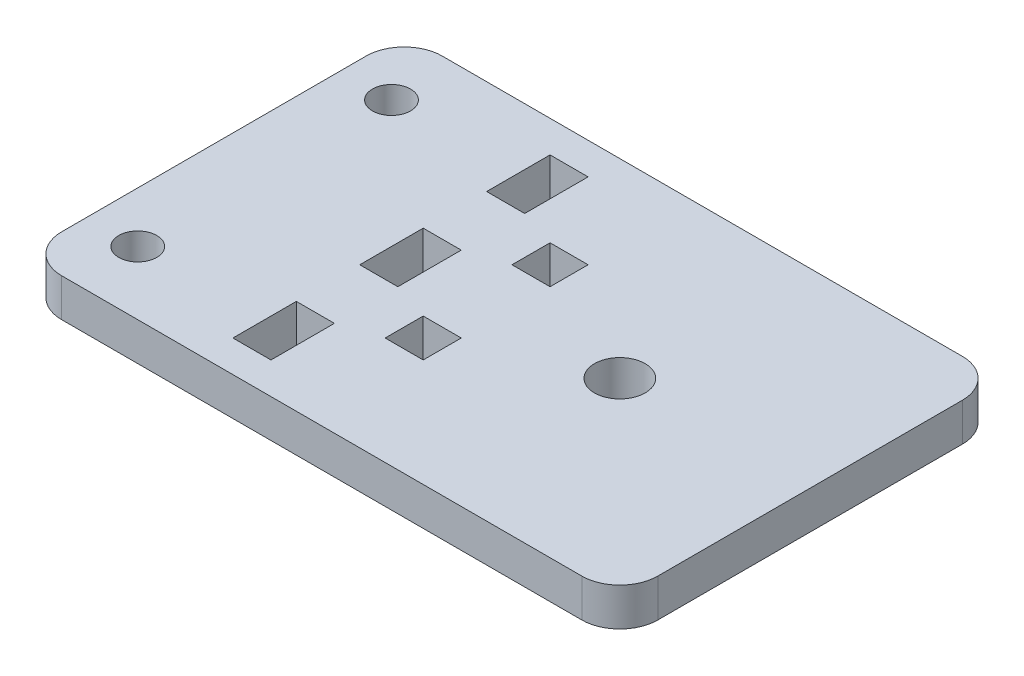
ISO-10303-21;
HEADER;
FILE_DESCRIPTION(('STEP AP214'),'2;1');
FILE_NAME('part.step','',(''),(''),'','','');
FILE_SCHEMA(('AUTOMOTIVE_DESIGN { 1 0 10303 214 1 1 1 1 }'));
ENDSEC;
DATA;
#1=APPLICATION_CONTEXT('core data for automotive mechanical design processes');
#2=APPLICATION_PROTOCOL_DEFINITION('international standard','automotive_design',2000,#1);
#3=PRODUCT_CONTEXT('',#1,'mechanical');
#4=PRODUCT('Part','Part','',(#3));
#5=PRODUCT_RELATED_PRODUCT_CATEGORY('part','',(#4));
#6=PRODUCT_DEFINITION_FORMATION('','',#4);
#7=PRODUCT_DEFINITION_CONTEXT('part definition',#1,'design');
#8=PRODUCT_DEFINITION('design','',#6,#7);
#9=PRODUCT_DEFINITION_SHAPE('','',#8);
#10=(LENGTH_UNIT() NAMED_UNIT(*) SI_UNIT(.MILLI.,.METRE.));
#11=(NAMED_UNIT(*) PLANE_ANGLE_UNIT() SI_UNIT($,.RADIAN.));
#12=(NAMED_UNIT(*) SI_UNIT($,.STERADIAN.) SOLID_ANGLE_UNIT());
#13=UNCERTAINTY_MEASURE_WITH_UNIT(LENGTH_MEASURE(1.E-05),#10,'distance_accuracy_value','');
#14=(GEOMETRIC_REPRESENTATION_CONTEXT(3) GLOBAL_UNCERTAINTY_ASSIGNED_CONTEXT((#13)) GLOBAL_UNIT_ASSIGNED_CONTEXT((#10,
#11,#12)) REPRESENTATION_CONTEXT('',''));
#15=CARTESIAN_POINT('',(0.,0.,0.));
#16=DIRECTION('',(0.,0.,1.));
#17=DIRECTION('',(1.,0.,0.));
#18=AXIS2_PLACEMENT_3D('',#15,#16,#17);
#19=CARTESIAN_POINT('',(-8.5,3.,-15.));
#20=DIRECTION('',(0.,0.,1.));
#21=DIRECTION('',(1.,0.,0.));
#22=AXIS2_PLACEMENT_3D('',#19,#20,#21);
#23=PLANE('',#22);
#24=DIRECTION('',(-1.,0.,0.));
#25=VECTOR('',#24,1.);
#26=CARTESIAN_POINT('',(-8.5,3.,-15.));
#27=LINE('',#26,#25);
#28=CARTESIAN_POINT('',(35.5,3.,-15.));
#29=VERTEX_POINT('',#28);
#30=CARTESIAN_POINT('',(-5.5,3.,-15.));
#31=VERTEX_POINT('',#30);
#32=EDGE_CURVE('E381',#29,#31,#27,.T.);
#33=ORIENTED_EDGE('',*,*,#32,.F.);
#34=DIRECTION('',(0.,1.,0.));
#35=VECTOR('',#34,1.);
#36=CARTESIAN_POINT('',(35.5,0.,-15.));
#37=LINE('',#36,#35);
#38=CARTESIAN_POINT('',(35.5,0.,-15.));
#39=VERTEX_POINT('',#38);
#40=EDGE_CURVE('E425',#29,#39,#37,.F.);
#41=ORIENTED_EDGE('',*,*,#40,.T.);
#42=DIRECTION('',(-1.,0.,0.));
#43=VECTOR('',#42,1.);
#44=CARTESIAN_POINT('',(-8.5,0.,-15.));
#45=LINE('',#44,#43);
#46=CARTESIAN_POINT('',(-5.5,0.,-15.));
#47=VERTEX_POINT('',#46);
#48=EDGE_CURVE('E374',#39,#47,#45,.T.);
#49=ORIENTED_EDGE('',*,*,#48,.T.);
#50=DIRECTION('',(0.,-1.,0.));
#51=VECTOR('',#50,1.);
#52=CARTESIAN_POINT('',(-5.5,3.,-15.));
#53=LINE('',#52,#51);
#54=EDGE_CURVE('E406',#47,#31,#53,.F.);
#55=ORIENTED_EDGE('',*,*,#54,.T.);
#56=EDGE_LOOP('',(#33,#41,#49,#55));
#57=FACE_BOUND('',#56,.T.);
#58=ADVANCED_FACE('F33',(#57),#23,.F.);
#59=CARTESIAN_POINT('',(-8.5,3.,-15.));
#60=DIRECTION('',(1.,0.,0.));
#61=DIRECTION('',(0.,0.,-1.));
#62=AXIS2_PLACEMENT_3D('',#59,#60,#61);
#63=PLANE('',#62);
#64=DIRECTION('',(0.,0.,1.));
#65=VECTOR('',#64,1.);
#66=CARTESIAN_POINT('',(-8.5,3.,-15.));
#67=LINE('',#66,#65);
#68=CARTESIAN_POINT('',(-8.5,3.,-12.));
#69=VERTEX_POINT('',#68);
#70=CARTESIAN_POINT('',(-8.5,3.,12.));
#71=VERTEX_POINT('',#70);
#72=EDGE_CURVE('E383',#69,#71,#67,.T.);
#73=ORIENTED_EDGE('',*,*,#72,.F.);
#74=DIRECTION('',(0.,-1.,0.));
#75=VECTOR('',#74,1.);
#76=CARTESIAN_POINT('',(-8.5,3.,-12.));
#77=LINE('',#76,#75);
#78=CARTESIAN_POINT('',(-8.5,0.,-12.));
#79=VERTEX_POINT('',#78);
#80=EDGE_CURVE('E398',#69,#79,#77,.T.);
#81=ORIENTED_EDGE('',*,*,#80,.T.);
#82=DIRECTION('',(0.,0.,1.));
#83=VECTOR('',#82,1.);
#84=CARTESIAN_POINT('',(-8.5,0.,-15.));
#85=LINE('',#84,#83);
#86=CARTESIAN_POINT('',(-8.5,0.,12.));
#87=VERTEX_POINT('',#86);
#88=EDGE_CURVE('E392',#79,#87,#85,.T.);
#89=ORIENTED_EDGE('',*,*,#88,.T.);
#90=DIRECTION('',(0.,-1.,0.));
#91=VECTOR('',#90,1.);
#92=CARTESIAN_POINT('',(-8.5,3.,12.));
#93=LINE('',#92,#91);
#94=EDGE_CURVE('E390',#87,#71,#93,.F.);
#95=ORIENTED_EDGE('',*,*,#94,.T.);
#96=EDGE_LOOP('',(#73,#81,#89,#95));
#97=FACE_BOUND('',#96,.T.);
#98=ADVANCED_FACE('F470',(#97),#63,.F.);
#99=CARTESIAN_POINT('',(-8.5,3.,15.));
#100=DIRECTION('',(0.,0.,-1.));
#101=DIRECTION('',(-1.,0.,0.));
#102=AXIS2_PLACEMENT_3D('',#99,#100,#101);
#103=PLANE('',#102);
#104=DIRECTION('',(1.,0.,0.));
#105=VECTOR('',#104,1.);
#106=CARTESIAN_POINT('',(-8.5,0.,15.));
#107=LINE('',#106,#105);
#108=CARTESIAN_POINT('',(-5.5,0.,15.));
#109=VERTEX_POINT('',#108);
#110=CARTESIAN_POINT('',(35.5,0.,15.));
#111=VERTEX_POINT('',#110);
#112=EDGE_CURVE('E384',#109,#111,#107,.T.);
#113=ORIENTED_EDGE('',*,*,#112,.T.);
#114=DIRECTION('',(0.,1.,0.));
#115=VECTOR('',#114,1.);
#116=CARTESIAN_POINT('',(35.5,3.,15.));
#117=LINE('',#116,#115);
#118=CARTESIAN_POINT('',(35.5,3.,15.));
#119=VERTEX_POINT('',#118);
#120=EDGE_CURVE('E431',#111,#119,#117,.T.);
#121=ORIENTED_EDGE('',*,*,#120,.T.);
#122=DIRECTION('',(1.,0.,0.));
#123=VECTOR('',#122,1.);
#124=CARTESIAN_POINT('',(-8.5,3.,15.));
#125=LINE('',#124,#123);
#126=CARTESIAN_POINT('',(-5.5,3.,15.));
#127=VERTEX_POINT('',#126);
#128=EDGE_CURVE('E387',#127,#119,#125,.T.);
#129=ORIENTED_EDGE('',*,*,#128,.F.);
#130=DIRECTION('',(0.,-1.,0.));
#131=VECTOR('',#130,1.);
#132=CARTESIAN_POINT('',(-5.5,3.,15.));
#133=LINE('',#132,#131);
#134=EDGE_CURVE('E413',#127,#109,#133,.T.);
#135=ORIENTED_EDGE('',*,*,#134,.T.);
#136=EDGE_LOOP('',(#113,#121,#129,#135));
#137=FACE_BOUND('',#136,.T.);
#138=ADVANCED_FACE('F476',(#137),#103,.F.);
#139=CARTESIAN_POINT('',(0.,3.,0.));
#140=DIRECTION('',(0.,1.,0.));
#141=DIRECTION('',(0.,0.,1.));
#142=AXIS2_PLACEMENT_3D('',#139,#140,#141);
#143=PLANE('',#142);
#144=DIRECTION('',(1.,0.,0.));
#145=VECTOR('',#144,1.);
#146=CARTESIAN_POINT('',(11.5,3.,6.5));
#147=LINE('',#146,#145);
#148=CARTESIAN_POINT('',(11.5,3.,6.5));
#149=VERTEX_POINT('',#148);
#150=CARTESIAN_POINT('',(14.5,3.,6.5));
#151=VERTEX_POINT('',#150);
#152=EDGE_CURVE('E48',#149,#151,#147,.T.);
#153=ORIENTED_EDGE('',*,*,#152,.F.);
#154=DIRECTION('',(0.,0.,1.));
#155=VECTOR('',#154,1.);
#156=CARTESIAN_POINT('',(11.5,3.,6.5));
#157=LINE('',#156,#155);
#158=CARTESIAN_POINT('',(11.5,3.,3.5));
#159=VERTEX_POINT('',#158);
#160=EDGE_CURVE('E237',#159,#149,#157,.T.);
#161=ORIENTED_EDGE('',*,*,#160,.F.);
#162=DIRECTION('',(-1.,0.,0.));
#163=VECTOR('',#162,1.);
#164=CARTESIAN_POINT('',(11.5,3.,3.5));
#165=LINE('',#164,#163);
#166=CARTESIAN_POINT('',(14.5,3.,3.5));
#167=VERTEX_POINT('',#166);
#168=EDGE_CURVE('E221',#167,#159,#165,.T.);
#169=ORIENTED_EDGE('',*,*,#168,.F.);
#170=DIRECTION('',(0.,0.,-1.));
#171=VECTOR('',#170,1.);
#172=CARTESIAN_POINT('',(14.5,3.,6.5));
#173=LINE('',#172,#171);
#174=EDGE_CURVE('E230',#151,#167,#173,.T.);
#175=ORIENTED_EDGE('',*,*,#174,.F.);
#176=EDGE_LOOP('',(#153,#161,#169,#175));
#177=FACE_BOUND('',#176,.T.);
#178=DIRECTION('',(1.,0.,0.));
#179=VECTOR('',#178,1.);
#180=CARTESIAN_POINT('',(11.5,3.,-3.49999999999999));
#181=LINE('',#180,#179);
#182=CARTESIAN_POINT('',(11.5,3.,-3.49999999999999));
#183=VERTEX_POINT('',#182);
#184=CARTESIAN_POINT('',(14.5,3.,-3.5));
#185=VERTEX_POINT('',#184);
#186=EDGE_CURVE('E244',#183,#185,#181,.T.);
#187=ORIENTED_EDGE('',*,*,#186,.F.);
#188=DIRECTION('',(0.,0.,1.));
#189=VECTOR('',#188,1.);
#190=CARTESIAN_POINT('',(11.5,3.,-3.49999999999999));
#191=LINE('',#190,#189);
#192=CARTESIAN_POINT('',(11.5,3.,-6.5));
#193=VERTEX_POINT('',#192);
#194=EDGE_CURVE('E254',#193,#183,#191,.T.);
#195=ORIENTED_EDGE('',*,*,#194,.F.);
#196=DIRECTION('',(-1.,0.,0.));
#197=VECTOR('',#196,1.);
#198=CARTESIAN_POINT('',(11.5,3.,-6.5));
#199=LINE('',#198,#197);
#200=CARTESIAN_POINT('',(14.5,3.,-6.5));
#201=VERTEX_POINT('',#200);
#202=EDGE_CURVE('E251',#201,#193,#199,.T.);
#203=ORIENTED_EDGE('',*,*,#202,.F.);
#204=DIRECTION('',(0.,0.,-1.));
#205=VECTOR('',#204,1.);
#206=CARTESIAN_POINT('',(14.5,3.,-3.5));
#207=LINE('',#206,#205);
#208=EDGE_CURVE('E248',#185,#201,#207,.T.);
#209=ORIENTED_EDGE('',*,*,#208,.F.);
#210=EDGE_LOOP('',(#187,#195,#203,#209));
#211=FACE_BOUND('',#210,.T.);
#212=CARTESIAN_POINT('',(23.5,3.,0.));
#213=DIRECTION('',(0.,1.,0.));
#214=DIRECTION('',(0.,0.,1.));
#215=AXIS2_PLACEMENT_3D('',#212,#213,#214);
#216=CIRCLE('',#215,2.);
#217=CARTESIAN_POINT('',(23.5,3.,2.00000000000001));
#218=VERTEX_POINT('',#217);
#219=EDGE_CURVE('E260',#218,#218,#216,.T.);
#220=ORIENTED_EDGE('',*,*,#219,.F.);
#221=EDGE_LOOP('',(#220));
#222=FACE_BOUND('',#221,.T.);
#223=DIRECTION('',(0.,0.,-1.));
#224=VECTOR('',#223,1.);
#225=CARTESIAN_POINT('',(38.5,3.,15.));
#226=LINE('',#225,#224);
#227=CARTESIAN_POINT('',(38.5,3.,12.));
#228=VERTEX_POINT('',#227);
#229=CARTESIAN_POINT('',(38.5,3.,-12.));
#230=VERTEX_POINT('',#229);
#231=EDGE_CURVE('E270',#228,#230,#226,.T.);
#232=ORIENTED_EDGE('',*,*,#231,.T.);
#233=CARTESIAN_POINT('',(35.5,3.,-12.));
#234=DIRECTION('',(0.,1.,0.));
#235=DIRECTION('',(0.,0.,1.));
#236=AXIS2_PLACEMENT_3D('',#233,#234,#235);
#237=CIRCLE('',#236,3.);
#238=EDGE_CURVE('E423',#230,#29,#237,.T.);
#239=ORIENTED_EDGE('',*,*,#238,.T.);
#240=ORIENTED_EDGE('',*,*,#32,.T.);
#241=CARTESIAN_POINT('',(-5.5,3.,-12.));
#242=DIRECTION('',(0.,1.,0.));
#243=DIRECTION('',(0.,0.,1.));
#244=AXIS2_PLACEMENT_3D('',#241,#242,#243);
#245=CIRCLE('',#244,3.);
#246=EDGE_CURVE('E411',#31,#69,#245,.T.);
#247=ORIENTED_EDGE('',*,*,#246,.T.);
#248=ORIENTED_EDGE('',*,*,#72,.T.);
#249=CARTESIAN_POINT('',(-5.5,3.,12.));
#250=DIRECTION('',(0.,1.,0.));
#251=DIRECTION('',(0.,0.,1.));
#252=AXIS2_PLACEMENT_3D('',#249,#250,#251);
#253=CIRCLE('',#252,3.);
#254=EDGE_CURVE('E409',#71,#127,#253,.T.);
#255=ORIENTED_EDGE('',*,*,#254,.T.);
#256=ORIENTED_EDGE('',*,*,#128,.T.);
#257=CARTESIAN_POINT('',(35.5,3.,12.));
#258=DIRECTION('',(0.,1.,0.));
#259=DIRECTION('',(0.,0.,1.));
#260=AXIS2_PLACEMENT_3D('',#257,#258,#259);
#261=CIRCLE('',#260,3.);
#262=EDGE_CURVE('E421',#119,#228,#261,.T.);
#263=ORIENTED_EDGE('',*,*,#262,.T.);
#264=EDGE_LOOP('',(#232,#239,#240,#247,#248,#255,#256,#263));
#265=FACE_BOUND('',#264,.T.);
#266=DIRECTION('',(0.,0.,1.));
#267=VECTOR('',#266,1.);
#268=CARTESIAN_POINT('',(8.5,3.,15.));
#269=LINE('',#268,#267);
#270=CARTESIAN_POINT('',(8.5,3.,-12.5));
#271=VERTEX_POINT('',#270);
#272=CARTESIAN_POINT('',(8.5,3.,-7.5));
#273=VERTEX_POINT('',#272);
#274=EDGE_CURVE('E277',#271,#273,#269,.T.);
#275=ORIENTED_EDGE('',*,*,#274,.T.);
#276=DIRECTION('',(1.,0.,0.));
#277=VECTOR('',#276,1.);
#278=CARTESIAN_POINT('',(5.5,3.,-7.5));
#279=LINE('',#278,#277);
#280=CARTESIAN_POINT('',(5.5,3.,-7.5));
#281=VERTEX_POINT('',#280);
#282=EDGE_CURVE('E358',#281,#273,#279,.T.);
#283=ORIENTED_EDGE('',*,*,#282,.F.);
#284=DIRECTION('',(0.,0.,1.));
#285=VECTOR('',#284,1.);
#286=CARTESIAN_POINT('',(5.5,3.,-12.5));
#287=LINE('',#286,#285);
#288=CARTESIAN_POINT('',(5.5,3.,-12.5));
#289=VERTEX_POINT('',#288);
#290=EDGE_CURVE('E367',#289,#281,#287,.T.);
#291=ORIENTED_EDGE('',*,*,#290,.F.);
#292=DIRECTION('',(-1.,0.,0.));
#293=VECTOR('',#292,1.);
#294=CARTESIAN_POINT('',(8.5,3.,-12.5));
#295=LINE('',#294,#293);
#296=EDGE_CURVE('E323',#271,#289,#295,.T.);
#297=ORIENTED_EDGE('',*,*,#296,.F.);
#298=EDGE_LOOP('',(#275,#283,#291,#297));
#299=FACE_BOUND('',#298,.T.);
#300=CARTESIAN_POINT('',(8.5,3.,-2.5));
#301=VERTEX_POINT('',#300);
#302=CARTESIAN_POINT('',(8.5,3.,2.5));
#303=VERTEX_POINT('',#302);
#304=EDGE_CURVE('E287',#301,#303,#269,.T.);
#305=ORIENTED_EDGE('',*,*,#304,.T.);
#306=DIRECTION('',(1.,0.,0.));
#307=VECTOR('',#306,1.);
#308=CARTESIAN_POINT('',(8.5,3.,2.5));
#309=LINE('',#308,#307);
#310=CARTESIAN_POINT('',(5.50000000000001,3.,2.5));
#311=VERTEX_POINT('',#310);
#312=EDGE_CURVE('E305',#311,#303,#309,.T.);
#313=ORIENTED_EDGE('',*,*,#312,.F.);
#314=DIRECTION('',(0.,0.,1.));
#315=VECTOR('',#314,1.);
#316=CARTESIAN_POINT('',(5.5,3.,-2.5));
#317=LINE('',#316,#315);
#318=CARTESIAN_POINT('',(5.5,3.,-2.5));
#319=VERTEX_POINT('',#318);
#320=EDGE_CURVE('E315',#319,#311,#317,.T.);
#321=ORIENTED_EDGE('',*,*,#320,.F.);
#322=DIRECTION('',(-1.,0.,0.));
#323=VECTOR('',#322,1.);
#324=CARTESIAN_POINT('',(8.5,3.,-2.5));
#325=LINE('',#324,#323);
#326=EDGE_CURVE('E312',#301,#319,#325,.T.);
#327=ORIENTED_EDGE('',*,*,#326,.F.);
#328=EDGE_LOOP('',(#305,#313,#321,#327));
#329=FACE_BOUND('',#328,.T.);
#330=CARTESIAN_POINT('',(-4.5,3.,10.));
#331=DIRECTION('',(0.,1.,0.));
#332=DIRECTION('',(0.,0.,1.));
#333=AXIS2_PLACEMENT_3D('',#330,#331,#332);
#334=CIRCLE('',#333,1.5);
#335=CARTESIAN_POINT('',(-4.5,3.,11.5));
#336=VERTEX_POINT('',#335);
#337=EDGE_CURVE('E292',#336,#336,#334,.T.);
#338=ORIENTED_EDGE('',*,*,#337,.F.);
#339=EDGE_LOOP('',(#338));
#340=FACE_BOUND('',#339,.T.);
#341=CARTESIAN_POINT('',(-4.5,3.,-10.));
#342=DIRECTION('',(0.,1.,0.));
#343=DIRECTION('',(0.,0.,1.));
#344=AXIS2_PLACEMENT_3D('',#341,#342,#343);
#345=CIRCLE('',#344,1.5);
#346=CARTESIAN_POINT('',(-4.5,3.,-8.5));
#347=VERTEX_POINT('',#346);
#348=EDGE_CURVE('E291',#347,#347,#345,.T.);
#349=ORIENTED_EDGE('',*,*,#348,.F.);
#350=EDGE_LOOP('',(#349));
#351=FACE_BOUND('',#350,.T.);
#352=DIRECTION('',(-1.,0.,0.));
#353=VECTOR('',#352,1.);
#354=CARTESIAN_POINT('',(8.5,3.,7.5));
#355=LINE('',#354,#353);
#356=CARTESIAN_POINT('',(8.5,3.,7.5));
#357=VERTEX_POINT('',#356);
#358=CARTESIAN_POINT('',(5.5,3.,7.5));
#359=VERTEX_POINT('',#358);
#360=EDGE_CURVE('E298',#357,#359,#355,.T.);
#361=ORIENTED_EDGE('',*,*,#360,.F.);
#362=CARTESIAN_POINT('',(8.5,3.,12.5));
#363=VERTEX_POINT('',#362);
#364=EDGE_CURVE('E284',#357,#363,#269,.T.);
#365=ORIENTED_EDGE('',*,*,#364,.T.);
#366=DIRECTION('',(1.,0.,0.));
#367=VECTOR('',#366,1.);
#368=CARTESIAN_POINT('',(8.5,3.,12.5));
#369=LINE('',#368,#367);
#370=CARTESIAN_POINT('',(5.50000000000001,3.,12.5));
#371=VERTEX_POINT('',#370);
#372=EDGE_CURVE('E334',#371,#363,#369,.T.);
#373=ORIENTED_EDGE('',*,*,#372,.F.);
#374=DIRECTION('',(0.,0.,1.));
#375=VECTOR('',#374,1.);
#376=CARTESIAN_POINT('',(5.5,3.,7.5));
#377=LINE('',#376,#375);
#378=EDGE_CURVE('E343',#359,#371,#377,.T.);
#379=ORIENTED_EDGE('',*,*,#378,.F.);
#380=EDGE_LOOP('',(#361,#365,#373,#379));
#381=FACE_BOUND('',#380,.T.);
#382=ADVANCED_FACE('F234',(#177,#211,#222,#265,#299,#329,#340,#351,#381),#143,.T.);
#383=CARTESIAN_POINT('',(0.,0.,0.));
#384=DIRECTION('',(0.,1.,0.));
#385=DIRECTION('',(0.,0.,1.));
#386=AXIS2_PLACEMENT_3D('',#383,#384,#385);
#387=PLANE('',#386);
#388=DIRECTION('',(0.,0.,1.));
#389=VECTOR('',#388,1.);
#390=CARTESIAN_POINT('',(11.5,0.,0.));
#391=LINE('',#390,#389);
#392=CARTESIAN_POINT('',(11.5,0.,3.5));
#393=VERTEX_POINT('',#392);
#394=CARTESIAN_POINT('',(11.5,0.,6.5));
#395=VERTEX_POINT('',#394);
#396=EDGE_CURVE('E41',#393,#395,#391,.T.);
#397=ORIENTED_EDGE('',*,*,#396,.T.);
#398=DIRECTION('',(1.,0.,0.));
#399=VECTOR('',#398,1.);
#400=CARTESIAN_POINT('',(0.,0.,6.50000000000001));
#401=LINE('',#400,#399);
#402=CARTESIAN_POINT('',(14.5,0.,6.5));
#403=VERTEX_POINT('',#402);
#404=EDGE_CURVE('E11',#395,#403,#401,.T.);
#405=ORIENTED_EDGE('',*,*,#404,.T.);
#406=DIRECTION('',(0.,0.,-1.));
#407=VECTOR('',#406,1.);
#408=CARTESIAN_POINT('',(14.5,0.,0.));
#409=LINE('',#408,#407);
#410=CARTESIAN_POINT('',(14.5,0.,3.5));
#411=VERTEX_POINT('',#410);
#412=EDGE_CURVE('E446',#403,#411,#409,.T.);
#413=ORIENTED_EDGE('',*,*,#412,.T.);
#414=DIRECTION('',(-1.,0.,0.));
#415=VECTOR('',#414,1.);
#416=CARTESIAN_POINT('',(0.,0.,3.5));
#417=LINE('',#416,#415);
#418=EDGE_CURVE('E224',#411,#393,#417,.T.);
#419=ORIENTED_EDGE('',*,*,#418,.T.);
#420=EDGE_LOOP('',(#397,#405,#413,#419));
#421=FACE_BOUND('',#420,.T.);
#422=DIRECTION('',(0.,0.,1.));
#423=VECTOR('',#422,1.);
#424=CARTESIAN_POINT('',(11.5,0.,0.));
#425=LINE('',#424,#423);
#426=CARTESIAN_POINT('',(11.5,0.,-6.5));
#427=VERTEX_POINT('',#426);
#428=CARTESIAN_POINT('',(11.5,0.,-3.49999999999999));
#429=VERTEX_POINT('',#428);
#430=EDGE_CURVE('E440',#427,#429,#425,.T.);
#431=ORIENTED_EDGE('',*,*,#430,.T.);
#432=DIRECTION('',(1.,0.,0.));
#433=VECTOR('',#432,1.);
#434=CARTESIAN_POINT('',(0.,0.,-3.49999999999999));
#435=LINE('',#434,#433);
#436=CARTESIAN_POINT('',(14.5,0.,-3.5));
#437=VERTEX_POINT('',#436);
#438=EDGE_CURVE('E443',#429,#437,#435,.T.);
#439=ORIENTED_EDGE('',*,*,#438,.T.);
#440=DIRECTION('',(0.,0.,-1.));
#441=VECTOR('',#440,1.);
#442=CARTESIAN_POINT('',(14.5,0.,0.));
#443=LINE('',#442,#441);
#444=CARTESIAN_POINT('',(14.5,0.,-6.5));
#445=VERTEX_POINT('',#444);
#446=EDGE_CURVE('E434',#437,#445,#443,.T.);
#447=ORIENTED_EDGE('',*,*,#446,.T.);
#448=DIRECTION('',(-1.,0.,0.));
#449=VECTOR('',#448,1.);
#450=CARTESIAN_POINT('',(0.,0.,-6.49999999999999));
#451=LINE('',#450,#449);
#452=EDGE_CURVE('E437',#445,#427,#451,.T.);
#453=ORIENTED_EDGE('',*,*,#452,.T.);
#454=EDGE_LOOP('',(#431,#439,#447,#453));
#455=FACE_BOUND('',#454,.T.);
#456=CARTESIAN_POINT('',(23.5,0.,0.));
#457=DIRECTION('',(0.,1.,0.));
#458=DIRECTION('',(0.,0.,1.));
#459=AXIS2_PLACEMENT_3D('',#456,#457,#458);
#460=CIRCLE('',#459,2.);
#461=CARTESIAN_POINT('',(23.5,0.,2.00000000000001));
#462=VERTEX_POINT('',#461);
#463=EDGE_CURVE('E267',#462,#462,#460,.T.);
#464=ORIENTED_EDGE('',*,*,#463,.T.);
#465=EDGE_LOOP('',(#464));
#466=FACE_BOUND('',#465,.T.);
#467=ORIENTED_EDGE('',*,*,#48,.F.);
#468=CARTESIAN_POINT('',(35.5,0.,-12.));
#469=DIRECTION('',(0.,1.,0.));
#470=DIRECTION('',(0.,0.,1.));
#471=AXIS2_PLACEMENT_3D('',#468,#469,#470);
#472=CIRCLE('',#471,3.);
#473=CARTESIAN_POINT('',(38.5,0.,-12.));
#474=VERTEX_POINT('',#473);
#475=EDGE_CURVE('E429',#39,#474,#472,.F.);
#476=ORIENTED_EDGE('',*,*,#475,.T.);
#477=DIRECTION('',(0.,0.,-1.));
#478=VECTOR('',#477,1.);
#479=CARTESIAN_POINT('',(38.5,0.,15.));
#480=LINE('',#479,#478);
#481=CARTESIAN_POINT('',(38.5,0.,12.));
#482=VERTEX_POINT('',#481);
#483=EDGE_CURVE('E273',#482,#474,#480,.T.);
#484=ORIENTED_EDGE('',*,*,#483,.F.);
#485=CARTESIAN_POINT('',(35.5,0.,12.));
#486=DIRECTION('',(0.,1.,0.));
#487=DIRECTION('',(0.,0.,1.));
#488=AXIS2_PLACEMENT_3D('',#485,#486,#487);
#489=CIRCLE('',#488,3.);
#490=EDGE_CURVE('E427',#482,#111,#489,.F.);
#491=ORIENTED_EDGE('',*,*,#490,.T.);
#492=ORIENTED_EDGE('',*,*,#112,.F.);
#493=CARTESIAN_POINT('',(-5.5,0.,12.));
#494=DIRECTION('',(0.,1.,0.));
#495=DIRECTION('',(0.,0.,1.));
#496=AXIS2_PLACEMENT_3D('',#493,#494,#495);
#497=CIRCLE('',#496,3.);
#498=EDGE_CURVE('E401',#109,#87,#497,.F.);
#499=ORIENTED_EDGE('',*,*,#498,.T.);
#500=ORIENTED_EDGE('',*,*,#88,.F.);
#501=CARTESIAN_POINT('',(-5.5,0.,-12.));
#502=DIRECTION('',(0.,1.,0.));
#503=DIRECTION('',(0.,0.,1.));
#504=AXIS2_PLACEMENT_3D('',#501,#502,#503);
#505=CIRCLE('',#504,3.);
#506=EDGE_CURVE('E403',#79,#47,#505,.F.);
#507=ORIENTED_EDGE('',*,*,#506,.T.);
#508=EDGE_LOOP('',(#467,#476,#484,#491,#492,#499,#500,#507));
#509=FACE_BOUND('',#508,.T.);
#510=DIRECTION('',(1.,0.,0.));
#511=VECTOR('',#510,1.);
#512=CARTESIAN_POINT('',(5.5,0.,-7.5));
#513=LINE('',#512,#511);
#514=CARTESIAN_POINT('',(5.5,0.,-7.5));
#515=VERTEX_POINT('',#514);
#516=CARTESIAN_POINT('',(8.5,0.,-7.5));
#517=VERTEX_POINT('',#516);
#518=EDGE_CURVE('E361',#515,#517,#513,.T.);
#519=ORIENTED_EDGE('',*,*,#518,.T.);
#520=DIRECTION('',(0.,0.,1.));
#521=VECTOR('',#520,1.);
#522=CARTESIAN_POINT('',(8.5,0.,15.));
#523=LINE('',#522,#521);
#524=CARTESIAN_POINT('',(8.5,0.,-12.5));
#525=VERTEX_POINT('',#524);
#526=EDGE_CURVE('E281',#525,#517,#523,.T.);
#527=ORIENTED_EDGE('',*,*,#526,.F.);
#528=DIRECTION('',(-1.,0.,0.));
#529=VECTOR('',#528,1.);
#530=CARTESIAN_POINT('',(8.5,0.,-12.5));
#531=LINE('',#530,#529);
#532=CARTESIAN_POINT('',(5.5,0.,-12.5));
#533=VERTEX_POINT('',#532);
#534=EDGE_CURVE('E354',#525,#533,#531,.T.);
#535=ORIENTED_EDGE('',*,*,#534,.T.);
#536=DIRECTION('',(0.,0.,1.));
#537=VECTOR('',#536,1.);
#538=CARTESIAN_POINT('',(5.5,0.,-12.5));
#539=LINE('',#538,#537);
#540=EDGE_CURVE('E357',#533,#515,#539,.T.);
#541=ORIENTED_EDGE('',*,*,#540,.T.);
#542=EDGE_LOOP('',(#519,#527,#535,#541));
#543=FACE_BOUND('',#542,.T.);
#544=DIRECTION('',(1.,0.,0.));
#545=VECTOR('',#544,1.);
#546=CARTESIAN_POINT('',(8.5,0.,2.5));
#547=LINE('',#546,#545);
#548=CARTESIAN_POINT('',(5.50000000000001,0.,2.5));
#549=VERTEX_POINT('',#548);
#550=CARTESIAN_POINT('',(8.5,0.,2.5));
#551=VERTEX_POINT('',#550);
#552=EDGE_CURVE('E308',#549,#551,#547,.T.);
#553=ORIENTED_EDGE('',*,*,#552,.T.);
#554=CARTESIAN_POINT('',(8.5,0.,-2.5));
#555=VERTEX_POINT('',#554);
#556=EDGE_CURVE('E280',#555,#551,#523,.T.);
#557=ORIENTED_EDGE('',*,*,#556,.F.);
#558=DIRECTION('',(-1.,0.,0.));
#559=VECTOR('',#558,1.);
#560=CARTESIAN_POINT('',(8.5,0.,-2.5));
#561=LINE('',#560,#559);
#562=CARTESIAN_POINT('',(5.5,0.,-2.5));
#563=VERTEX_POINT('',#562);
#564=EDGE_CURVE('E301',#555,#563,#561,.T.);
#565=ORIENTED_EDGE('',*,*,#564,.T.);
#566=DIRECTION('',(0.,0.,1.));
#567=VECTOR('',#566,1.);
#568=CARTESIAN_POINT('',(5.5,0.,-2.5));
#569=LINE('',#568,#567);
#570=EDGE_CURVE('E304',#563,#549,#569,.T.);
#571=ORIENTED_EDGE('',*,*,#570,.T.);
#572=EDGE_LOOP('',(#553,#557,#565,#571));
#573=FACE_BOUND('',#572,.T.);
#574=CARTESIAN_POINT('',(-4.5,0.,10.));
#575=DIRECTION('',(0.,1.,0.));
#576=DIRECTION('',(0.,0.,1.));
#577=AXIS2_PLACEMENT_3D('',#574,#575,#576);
#578=CIRCLE('',#577,1.5);
#579=CARTESIAN_POINT('',(-4.5,0.,11.5));
#580=VERTEX_POINT('',#579);
#581=EDGE_CURVE('E288',#580,#580,#578,.T.);
#582=ORIENTED_EDGE('',*,*,#581,.T.);
#583=EDGE_LOOP('',(#582));
#584=FACE_BOUND('',#583,.T.);
#585=CARTESIAN_POINT('',(-4.5,0.,-10.));
#586=DIRECTION('',(0.,1.,0.));
#587=DIRECTION('',(0.,0.,1.));
#588=AXIS2_PLACEMENT_3D('',#585,#586,#587);
#589=CIRCLE('',#588,1.5);
#590=CARTESIAN_POINT('',(-4.5,0.,-8.5));
#591=VERTEX_POINT('',#590);
#592=EDGE_CURVE('E295',#591,#591,#589,.T.);
#593=ORIENTED_EDGE('',*,*,#592,.T.);
#594=EDGE_LOOP('',(#593));
#595=FACE_BOUND('',#594,.T.);
#596=CARTESIAN_POINT('',(8.5,0.,7.5));
#597=VERTEX_POINT('',#596);
#598=CARTESIAN_POINT('',(8.5,0.,12.5));
#599=VERTEX_POINT('',#598);
#600=EDGE_CURVE('E276',#597,#599,#523,.T.);
#601=ORIENTED_EDGE('',*,*,#600,.F.);
#602=DIRECTION('',(-1.,0.,0.));
#603=VECTOR('',#602,1.);
#604=CARTESIAN_POINT('',(8.5,0.,7.5));
#605=LINE('',#604,#603);
#606=CARTESIAN_POINT('',(5.5,0.,7.5));
#607=VERTEX_POINT('',#606);
#608=EDGE_CURVE('E330',#597,#607,#605,.T.);
#609=ORIENTED_EDGE('',*,*,#608,.T.);
#610=DIRECTION('',(0.,0.,1.));
#611=VECTOR('',#610,1.);
#612=CARTESIAN_POINT('',(5.5,0.,7.5));
#613=LINE('',#612,#611);
#614=CARTESIAN_POINT('',(5.50000000000001,0.,12.5));
#615=VERTEX_POINT('',#614);
#616=EDGE_CURVE('E333',#607,#615,#613,.T.);
#617=ORIENTED_EDGE('',*,*,#616,.T.);
#618=DIRECTION('',(1.,0.,0.));
#619=VECTOR('',#618,1.);
#620=CARTESIAN_POINT('',(8.5,0.,12.5));
#621=LINE('',#620,#619);
#622=EDGE_CURVE('E337',#615,#599,#621,.T.);
#623=ORIENTED_EDGE('',*,*,#622,.T.);
#624=EDGE_LOOP('',(#601,#609,#617,#623));
#625=FACE_BOUND('',#624,.T.);
#626=ADVANCED_FACE('F450',(#421,#455,#466,#509,#543,#573,#584,#595,#625),#387,.F.);
#627=CARTESIAN_POINT('',(5.5,0.,-7.5));
#628=DIRECTION('',(0.,0.,1.));
#629=DIRECTION('',(1.,0.,0.));
#630=AXIS2_PLACEMENT_3D('',#627,#628,#629);
#631=PLANE('',#630);
#632=ORIENTED_EDGE('',*,*,#282,.T.);
#633=DIRECTION('',(0.,1.,0.));
#634=VECTOR('',#633,1.);
#635=CARTESIAN_POINT('',(8.5,0.,-7.5));
#636=LINE('',#635,#634);
#637=EDGE_CURVE('E372',#517,#273,#636,.T.);
#638=ORIENTED_EDGE('',*,*,#637,.F.);
#639=ORIENTED_EDGE('',*,*,#518,.F.);
#640=DIRECTION('',(0.,1.,0.));
#641=VECTOR('',#640,1.);
#642=CARTESIAN_POINT('',(5.5,0.,-7.5));
#643=LINE('',#642,#641);
#644=EDGE_CURVE('E375',#515,#281,#643,.T.);
#645=ORIENTED_EDGE('',*,*,#644,.T.);
#646=EDGE_LOOP('',(#632,#638,#639,#645));
#647=FACE_BOUND('',#646,.T.);
#648=ADVANCED_FACE('F572',(#647),#631,.F.);
#649=CARTESIAN_POINT('',(5.5,0.,-12.5));
#650=DIRECTION('',(-1.,0.,0.));
#651=DIRECTION('',(0.,0.,1.));
#652=AXIS2_PLACEMENT_3D('',#649,#650,#651);
#653=PLANE('',#652);
#654=ORIENTED_EDGE('',*,*,#290,.T.);
#655=ORIENTED_EDGE('',*,*,#644,.F.);
#656=ORIENTED_EDGE('',*,*,#540,.F.);
#657=DIRECTION('',(0.,1.,0.));
#658=VECTOR('',#657,1.);
#659=CARTESIAN_POINT('',(5.5,0.,-12.5));
#660=LINE('',#659,#658);
#661=EDGE_CURVE('E377',#533,#289,#660,.T.);
#662=ORIENTED_EDGE('',*,*,#661,.T.);
#663=EDGE_LOOP('',(#654,#655,#656,#662));
#664=FACE_BOUND('',#663,.T.);
#665=ADVANCED_FACE('F575',(#664),#653,.F.);
#666=CARTESIAN_POINT('',(8.5,0.,-12.5));
#667=DIRECTION('',(0.,0.,-1.));
#668=DIRECTION('',(-1.,0.,0.));
#669=AXIS2_PLACEMENT_3D('',#666,#667,#668);
#670=PLANE('',#669);
#671=ORIENTED_EDGE('',*,*,#296,.T.);
#672=ORIENTED_EDGE('',*,*,#661,.F.);
#673=ORIENTED_EDGE('',*,*,#534,.F.);
#674=DIRECTION('',(0.,1.,0.));
#675=VECTOR('',#674,1.);
#676=CARTESIAN_POINT('',(8.5,0.,-12.5));
#677=LINE('',#676,#675);
#678=EDGE_CURVE('E364',#525,#271,#677,.T.);
#679=ORIENTED_EDGE('',*,*,#678,.T.);
#680=EDGE_LOOP('',(#671,#672,#673,#679));
#681=FACE_BOUND('',#680,.T.);
#682=ADVANCED_FACE('F579',(#681),#670,.F.);
#683=CARTESIAN_POINT('',(8.5,0.,12.5));
#684=DIRECTION('',(0.,0.,1.));
#685=DIRECTION('',(1.,0.,0.));
#686=AXIS2_PLACEMENT_3D('',#683,#684,#685);
#687=PLANE('',#686);
#688=ORIENTED_EDGE('',*,*,#372,.T.);
#689=DIRECTION('',(0.,1.,0.));
#690=VECTOR('',#689,1.);
#691=CARTESIAN_POINT('',(8.5,0.,12.5));
#692=LINE('',#691,#690);
#693=EDGE_CURVE('E316',#599,#363,#692,.T.);
#694=ORIENTED_EDGE('',*,*,#693,.F.);
#695=ORIENTED_EDGE('',*,*,#622,.F.);
#696=DIRECTION('',(0.,1.,0.));
#697=VECTOR('',#696,1.);
#698=CARTESIAN_POINT('',(5.50000000000001,0.,12.5));
#699=LINE('',#698,#697);
#700=EDGE_CURVE('E349',#615,#371,#699,.T.);
#701=ORIENTED_EDGE('',*,*,#700,.T.);
#702=EDGE_LOOP('',(#688,#694,#695,#701));
#703=FACE_BOUND('',#702,.T.);
#704=ADVANCED_FACE('F554',(#703),#687,.F.);
#705=CARTESIAN_POINT('',(5.5,0.,7.5));
#706=DIRECTION('',(-1.,0.,0.));
#707=DIRECTION('',(0.,0.,1.));
#708=AXIS2_PLACEMENT_3D('',#705,#706,#707);
#709=PLANE('',#708);
#710=ORIENTED_EDGE('',*,*,#378,.T.);
#711=ORIENTED_EDGE('',*,*,#700,.F.);
#712=ORIENTED_EDGE('',*,*,#616,.F.);
#713=DIRECTION('',(0.,1.,0.));
#714=VECTOR('',#713,1.);
#715=CARTESIAN_POINT('',(5.5,0.,7.5));
#716=LINE('',#715,#714);
#717=EDGE_CURVE('E351',#607,#359,#716,.T.);
#718=ORIENTED_EDGE('',*,*,#717,.T.);
#719=EDGE_LOOP('',(#710,#711,#712,#718));
#720=FACE_BOUND('',#719,.T.);
#721=ADVANCED_FACE('F557',(#720),#709,.F.);
#722=CARTESIAN_POINT('',(8.5,0.,7.5));
#723=DIRECTION('',(0.,0.,-1.));
#724=DIRECTION('',(-1.,0.,0.));
#725=AXIS2_PLACEMENT_3D('',#722,#723,#724);
#726=PLANE('',#725);
#727=ORIENTED_EDGE('',*,*,#360,.T.);
#728=ORIENTED_EDGE('',*,*,#717,.F.);
#729=ORIENTED_EDGE('',*,*,#608,.F.);
#730=DIRECTION('',(0.,1.,0.));
#731=VECTOR('',#730,1.);
#732=CARTESIAN_POINT('',(8.5,0.,7.5));
#733=LINE('',#732,#731);
#734=EDGE_CURVE('E340',#597,#357,#733,.T.);
#735=ORIENTED_EDGE('',*,*,#734,.T.);
#736=EDGE_LOOP('',(#727,#728,#729,#735));
#737=FACE_BOUND('',#736,.T.);
#738=ADVANCED_FACE('F558',(#737),#726,.F.);
#739=CARTESIAN_POINT('',(8.5,0.,2.5));
#740=DIRECTION('',(0.,0.,1.));
#741=DIRECTION('',(1.,0.,0.));
#742=AXIS2_PLACEMENT_3D('',#739,#740,#741);
#743=PLANE('',#742);
#744=ORIENTED_EDGE('',*,*,#312,.T.);
#745=DIRECTION('',(0.,1.,0.));
#746=VECTOR('',#745,1.);
#747=CARTESIAN_POINT('',(8.5,0.,2.5));
#748=LINE('',#747,#746);
#749=EDGE_CURVE('E320',#551,#303,#748,.T.);
#750=ORIENTED_EDGE('',*,*,#749,.F.);
#751=ORIENTED_EDGE('',*,*,#552,.F.);
#752=DIRECTION('',(0.,1.,0.));
#753=VECTOR('',#752,1.);
#754=CARTESIAN_POINT('',(5.50000000000001,0.,2.5));
#755=LINE('',#754,#753);
#756=EDGE_CURVE('E324',#549,#311,#755,.T.);
#757=ORIENTED_EDGE('',*,*,#756,.T.);
#758=EDGE_LOOP('',(#744,#750,#751,#757));
#759=FACE_BOUND('',#758,.T.);
#760=ADVANCED_FACE('F560',(#759),#743,.F.);
#761=CARTESIAN_POINT('',(5.5,0.,-2.5));
#762=DIRECTION('',(-1.,0.,0.));
#763=DIRECTION('',(0.,0.,1.));
#764=AXIS2_PLACEMENT_3D('',#761,#762,#763);
#765=PLANE('',#764);
#766=ORIENTED_EDGE('',*,*,#320,.T.);
#767=ORIENTED_EDGE('',*,*,#756,.F.);
#768=ORIENTED_EDGE('',*,*,#570,.F.);
#769=DIRECTION('',(0.,1.,0.));
#770=VECTOR('',#769,1.);
#771=CARTESIAN_POINT('',(5.5,0.,-2.5));
#772=LINE('',#771,#770);
#773=EDGE_CURVE('E326',#563,#319,#772,.T.);
#774=ORIENTED_EDGE('',*,*,#773,.T.);
#775=EDGE_LOOP('',(#766,#767,#768,#774));
#776=FACE_BOUND('',#775,.T.);
#777=ADVANCED_FACE('F566',(#776),#765,.F.);
#778=CARTESIAN_POINT('',(8.5,0.,-2.5));
#779=DIRECTION('',(0.,0.,-1.));
#780=DIRECTION('',(-1.,0.,0.));
#781=AXIS2_PLACEMENT_3D('',#778,#779,#780);
#782=PLANE('',#781);
#783=ORIENTED_EDGE('',*,*,#326,.T.);
#784=ORIENTED_EDGE('',*,*,#773,.F.);
#785=ORIENTED_EDGE('',*,*,#564,.F.);
#786=DIRECTION('',(0.,1.,0.));
#787=VECTOR('',#786,1.);
#788=CARTESIAN_POINT('',(8.5,0.,-2.5));
#789=LINE('',#788,#787);
#790=EDGE_CURVE('E311',#555,#301,#789,.T.);
#791=ORIENTED_EDGE('',*,*,#790,.T.);
#792=EDGE_LOOP('',(#783,#784,#785,#791));
#793=FACE_BOUND('',#792,.T.);
#794=ADVANCED_FACE('F640',(#793),#782,.F.);
#795=CARTESIAN_POINT('',(-4.5,0.,-10.));
#796=DIRECTION('',(0.,1.,0.));
#797=DIRECTION('',(0.,0.,1.));
#798=AXIS2_PLACEMENT_3D('',#795,#796,#797);
#799=CYLINDRICAL_SURFACE('',#798,1.5);
#800=ORIENTED_EDGE('',*,*,#592,.F.);
#801=EDGE_LOOP('',(#800));
#802=FACE_BOUND('',#801,.T.);
#803=ORIENTED_EDGE('',*,*,#348,.T.);
#804=EDGE_LOOP('',(#803));
#805=FACE_BOUND('',#804,.T.);
#806=ADVANCED_FACE('F649',(#802,#805),#799,.F.);
#807=CARTESIAN_POINT('',(-4.5,0.,10.));
#808=DIRECTION('',(0.,1.,0.));
#809=DIRECTION('',(0.,0.,1.));
#810=AXIS2_PLACEMENT_3D('',#807,#808,#809);
#811=CYLINDRICAL_SURFACE('',#810,1.5);
#812=ORIENTED_EDGE('',*,*,#581,.F.);
#813=EDGE_LOOP('',(#812));
#814=FACE_BOUND('',#813,.T.);
#815=ORIENTED_EDGE('',*,*,#337,.T.);
#816=EDGE_LOOP('',(#815));
#817=FACE_BOUND('',#816,.T.);
#818=ADVANCED_FACE('F486',(#814,#817),#811,.F.);
#819=CARTESIAN_POINT('',(-5.5,3.,-12.));
#820=DIRECTION('',(0.,-1.,0.));
#821=DIRECTION('',(0.,0.,-1.));
#822=AXIS2_PLACEMENT_3D('',#819,#820,#821);
#823=CYLINDRICAL_SURFACE('',#822,3.);
#824=ORIENTED_EDGE('',*,*,#246,.F.);
#825=ORIENTED_EDGE('',*,*,#54,.F.);
#826=ORIENTED_EDGE('',*,*,#506,.F.);
#827=ORIENTED_EDGE('',*,*,#80,.F.);
#828=EDGE_LOOP('',(#824,#825,#826,#827));
#829=FACE_BOUND('',#828,.T.);
#830=ADVANCED_FACE('F482',(#829),#823,.T.);
#831=CARTESIAN_POINT('',(-5.5,3.,12.));
#832=DIRECTION('',(0.,-1.,0.));
#833=DIRECTION('',(0.,0.,-1.));
#834=AXIS2_PLACEMENT_3D('',#831,#832,#833);
#835=CYLINDRICAL_SURFACE('',#834,3.);
#836=ORIENTED_EDGE('',*,*,#254,.F.);
#837=ORIENTED_EDGE('',*,*,#94,.F.);
#838=ORIENTED_EDGE('',*,*,#498,.F.);
#839=ORIENTED_EDGE('',*,*,#134,.F.);
#840=EDGE_LOOP('',(#836,#837,#838,#839));
#841=FACE_BOUND('',#840,.T.);
#842=ADVANCED_FACE('F485',(#841),#835,.T.);
#843=CARTESIAN_POINT('',(8.5,0.,15.));
#844=DIRECTION('',(-1.,0.,0.));
#845=DIRECTION('',(0.,0.,1.));
#846=AXIS2_PLACEMENT_3D('',#843,#844,#845);
#847=PLANE('',#846);
#848=ORIENTED_EDGE('',*,*,#637,.T.);
#849=ORIENTED_EDGE('',*,*,#274,.F.);
#850=ORIENTED_EDGE('',*,*,#678,.F.);
#851=ORIENTED_EDGE('',*,*,#526,.T.);
#852=EDGE_LOOP('',(#848,#849,#850,#851));
#853=FACE_BOUND('',#852,.T.);
#854=ADVANCED_FACE('F489',(#853),#847,.T.);
#855=ORIENTED_EDGE('',*,*,#693,.T.);
#856=ORIENTED_EDGE('',*,*,#364,.F.);
#857=ORIENTED_EDGE('',*,*,#734,.F.);
#858=ORIENTED_EDGE('',*,*,#600,.T.);
#859=EDGE_LOOP('',(#855,#856,#857,#858));
#860=FACE_BOUND('',#859,.T.);
#861=ADVANCED_FACE('F550',(#860),#847,.T.);
#862=ORIENTED_EDGE('',*,*,#749,.T.);
#863=ORIENTED_EDGE('',*,*,#304,.F.);
#864=ORIENTED_EDGE('',*,*,#790,.F.);
#865=ORIENTED_EDGE('',*,*,#556,.T.);
#866=EDGE_LOOP('',(#862,#863,#864,#865));
#867=FACE_BOUND('',#866,.T.);
#868=ADVANCED_FACE('F501',(#867),#847,.T.);
#869=CARTESIAN_POINT('',(38.5,0.,15.));
#870=DIRECTION('',(1.,0.,0.));
#871=DIRECTION('',(0.,0.,-1.));
#872=AXIS2_PLACEMENT_3D('',#869,#870,#871);
#873=PLANE('',#872);
#874=ORIENTED_EDGE('',*,*,#483,.T.);
#875=DIRECTION('',(0.,1.,0.));
#876=VECTOR('',#875,1.);
#877=CARTESIAN_POINT('',(38.5,3.,-12.));
#878=LINE('',#877,#876);
#879=EDGE_CURVE('E418',#474,#230,#878,.T.);
#880=ORIENTED_EDGE('',*,*,#879,.T.);
#881=ORIENTED_EDGE('',*,*,#231,.F.);
#882=DIRECTION('',(0.,1.,0.));
#883=VECTOR('',#882,1.);
#884=CARTESIAN_POINT('',(38.5,0.,12.));
#885=LINE('',#884,#883);
#886=EDGE_CURVE('E416',#228,#482,#885,.F.);
#887=ORIENTED_EDGE('',*,*,#886,.T.);
#888=EDGE_LOOP('',(#874,#880,#881,#887));
#889=FACE_BOUND('',#888,.T.);
#890=ADVANCED_FACE('F493',(#889),#873,.T.);
#891=CARTESIAN_POINT('',(35.5,0.,-12.));
#892=DIRECTION('',(0.,-1.,0.));
#893=DIRECTION('',(0.,0.,-1.));
#894=AXIS2_PLACEMENT_3D('',#891,#892,#893);
#895=CYLINDRICAL_SURFACE('',#894,3.);
#896=ORIENTED_EDGE('',*,*,#475,.F.);
#897=ORIENTED_EDGE('',*,*,#40,.F.);
#898=ORIENTED_EDGE('',*,*,#238,.F.);
#899=ORIENTED_EDGE('',*,*,#879,.F.);
#900=EDGE_LOOP('',(#896,#897,#898,#899));
#901=FACE_BOUND('',#900,.T.);
#902=ADVANCED_FACE('F491',(#901),#895,.T.);
#903=CARTESIAN_POINT('',(35.5,3.,12.));
#904=DIRECTION('',(0.,-1.,0.));
#905=DIRECTION('',(0.,0.,-1.));
#906=AXIS2_PLACEMENT_3D('',#903,#904,#905);
#907=CYLINDRICAL_SURFACE('',#906,3.);
#908=ORIENTED_EDGE('',*,*,#490,.F.);
#909=ORIENTED_EDGE('',*,*,#886,.F.);
#910=ORIENTED_EDGE('',*,*,#262,.F.);
#911=ORIENTED_EDGE('',*,*,#120,.F.);
#912=EDGE_LOOP('',(#908,#909,#910,#911));
#913=FACE_BOUND('',#912,.T.);
#914=ADVANCED_FACE('F35',(#913),#907,.T.);
#915=CARTESIAN_POINT('',(23.5,0.,0.));
#916=DIRECTION('',(0.,1.,0.));
#917=DIRECTION('',(0.,0.,1.));
#918=AXIS2_PLACEMENT_3D('',#915,#916,#917);
#919=CYLINDRICAL_SURFACE('',#918,2.);
#920=ORIENTED_EDGE('',*,*,#463,.F.);
#921=EDGE_LOOP('',(#920));
#922=FACE_BOUND('',#921,.T.);
#923=ORIENTED_EDGE('',*,*,#219,.T.);
#924=EDGE_LOOP('',(#923));
#925=FACE_BOUND('',#924,.T.);
#926=ADVANCED_FACE('F499',(#922,#925),#919,.F.);
#927=CARTESIAN_POINT('',(11.5,-7.,-3.49999999999999));
#928=DIRECTION('',(0.,0.,1.));
#929=DIRECTION('',(1.,0.,0.));
#930=AXIS2_PLACEMENT_3D('',#927,#928,#929);
#931=PLANE('',#930);
#932=DIRECTION('',(0.,1.,0.));
#933=VECTOR('',#932,1.);
#934=CARTESIAN_POINT('',(11.5,-7.,-3.49999999999999));
#935=LINE('',#934,#933);
#936=EDGE_CURVE('E258',#429,#183,#935,.T.);
#937=ORIENTED_EDGE('',*,*,#936,.T.);
#938=ORIENTED_EDGE('',*,*,#186,.T.);
#939=DIRECTION('',(0.,1.,0.));
#940=VECTOR('',#939,1.);
#941=CARTESIAN_POINT('',(14.5,-7.,-3.5));
#942=LINE('',#941,#940);
#943=EDGE_CURVE('E257',#437,#185,#942,.T.);
#944=ORIENTED_EDGE('',*,*,#943,.F.);
#945=ORIENTED_EDGE('',*,*,#438,.F.);
#946=EDGE_LOOP('',(#937,#938,#944,#945));
#947=FACE_BOUND('',#946,.T.);
#948=ADVANCED_FACE('F721',(#947),#931,.F.);
#949=CARTESIAN_POINT('',(11.5,-7.,-3.49999999999999));
#950=DIRECTION('',(-1.,0.,0.));
#951=DIRECTION('',(0.,0.,1.));
#952=AXIS2_PLACEMENT_3D('',#949,#950,#951);
#953=PLANE('',#952);
#954=DIRECTION('',(0.,1.,0.));
#955=VECTOR('',#954,1.);
#956=CARTESIAN_POINT('',(11.5,-7.,-6.5));
#957=LINE('',#956,#955);
#958=EDGE_CURVE('E261',#427,#193,#957,.T.);
#959=ORIENTED_EDGE('',*,*,#958,.T.);
#960=ORIENTED_EDGE('',*,*,#194,.T.);
#961=ORIENTED_EDGE('',*,*,#936,.F.);
#962=ORIENTED_EDGE('',*,*,#430,.F.);
#963=EDGE_LOOP('',(#959,#960,#961,#962));
#964=FACE_BOUND('',#963,.T.);
#965=ADVANCED_FACE('F731',(#964),#953,.F.);
#966=CARTESIAN_POINT('',(11.5,-7.,-6.5));
#967=DIRECTION('',(0.,0.,-1.));
#968=DIRECTION('',(-1.,0.,0.));
#969=AXIS2_PLACEMENT_3D('',#966,#967,#968);
#970=PLANE('',#969);
#971=DIRECTION('',(0.,1.,0.));
#972=VECTOR('',#971,1.);
#973=CARTESIAN_POINT('',(14.5,-7.,-6.5));
#974=LINE('',#973,#972);
#975=EDGE_CURVE('E263',#445,#201,#974,.T.);
#976=ORIENTED_EDGE('',*,*,#975,.T.);
#977=ORIENTED_EDGE('',*,*,#202,.T.);
#978=ORIENTED_EDGE('',*,*,#958,.F.);
#979=ORIENTED_EDGE('',*,*,#452,.F.);
#980=EDGE_LOOP('',(#976,#977,#978,#979));
#981=FACE_BOUND('',#980,.T.);
#982=ADVANCED_FACE('F464',(#981),#970,.F.);
#983=CARTESIAN_POINT('',(14.5,-7.,-3.5));
#984=DIRECTION('',(1.,0.,0.));
#985=DIRECTION('',(0.,0.,-1.));
#986=AXIS2_PLACEMENT_3D('',#983,#984,#985);
#987=PLANE('',#986);
#988=ORIENTED_EDGE('',*,*,#943,.T.);
#989=ORIENTED_EDGE('',*,*,#208,.T.);
#990=ORIENTED_EDGE('',*,*,#975,.F.);
#991=ORIENTED_EDGE('',*,*,#446,.F.);
#992=EDGE_LOOP('',(#988,#989,#990,#991));
#993=FACE_BOUND('',#992,.T.);
#994=ADVANCED_FACE('F457',(#993),#987,.F.);
#995=CARTESIAN_POINT('',(11.5,-7.,6.5));
#996=DIRECTION('',(0.,0.,1.));
#997=DIRECTION('',(1.,0.,0.));
#998=AXIS2_PLACEMENT_3D('',#995,#996,#997);
#999=PLANE('',#998);
#1000=DIRECTION('',(0.,1.,0.));
#1001=VECTOR('',#1000,1.);
#1002=CARTESIAN_POINT('',(11.5,-7.,6.5));
#1003=LINE('',#1002,#1001);
#1004=EDGE_CURVE('E242',#395,#149,#1003,.T.);
#1005=ORIENTED_EDGE('',*,*,#1004,.T.);
#1006=ORIENTED_EDGE('',*,*,#152,.T.);
#1007=DIRECTION('',(0.,1.,0.));
#1008=VECTOR('',#1007,1.);
#1009=CARTESIAN_POINT('',(14.5,-7.,6.5));
#1010=LINE('',#1009,#1008);
#1011=EDGE_CURVE('E227',#403,#151,#1010,.T.);
#1012=ORIENTED_EDGE('',*,*,#1011,.F.);
#1013=ORIENTED_EDGE('',*,*,#404,.F.);
#1014=EDGE_LOOP('',(#1005,#1006,#1012,#1013));
#1015=FACE_BOUND('',#1014,.T.);
#1016=ADVANCED_FACE('F455',(#1015),#999,.F.);
#1017=CARTESIAN_POINT('',(11.5,-7.,6.5));
#1018=DIRECTION('',(-1.,0.,0.));
#1019=DIRECTION('',(0.,0.,1.));
#1020=AXIS2_PLACEMENT_3D('',#1017,#1018,#1019);
#1021=PLANE('',#1020);
#1022=DIRECTION('',(0.,1.,0.));
#1023=VECTOR('',#1022,1.);
#1024=CARTESIAN_POINT('',(11.5,-7.,3.5));
#1025=LINE('',#1024,#1023);
#1026=EDGE_CURVE('E226',#393,#159,#1025,.T.);
#1027=ORIENTED_EDGE('',*,*,#1026,.T.);
#1028=ORIENTED_EDGE('',*,*,#160,.T.);
#1029=ORIENTED_EDGE('',*,*,#1004,.F.);
#1030=ORIENTED_EDGE('',*,*,#396,.F.);
#1031=EDGE_LOOP('',(#1027,#1028,#1029,#1030));
#1032=FACE_BOUND('',#1031,.T.);
#1033=ADVANCED_FACE('F454',(#1032),#1021,.F.);
#1034=CARTESIAN_POINT('',(11.5,-7.,3.5));
#1035=DIRECTION('',(0.,0.,-1.));
#1036=DIRECTION('',(-1.,0.,0.));
#1037=AXIS2_PLACEMENT_3D('',#1034,#1035,#1036);
#1038=PLANE('',#1037);
#1039=DIRECTION('',(0.,1.,0.));
#1040=VECTOR('',#1039,1.);
#1041=CARTESIAN_POINT('',(14.5,-7.,3.5));
#1042=LINE('',#1041,#1040);
#1043=EDGE_CURVE('E56',#411,#167,#1042,.T.);
#1044=ORIENTED_EDGE('',*,*,#1043,.T.);
#1045=ORIENTED_EDGE('',*,*,#168,.T.);
#1046=ORIENTED_EDGE('',*,*,#1026,.F.);
#1047=ORIENTED_EDGE('',*,*,#418,.F.);
#1048=EDGE_LOOP('',(#1044,#1045,#1046,#1047));
#1049=FACE_BOUND('',#1048,.T.);
#1050=ADVANCED_FACE('F218',(#1049),#1038,.F.);
#1051=CARTESIAN_POINT('',(14.5,-7.,6.5));
#1052=DIRECTION('',(1.,0.,0.));
#1053=DIRECTION('',(0.,0.,-1.));
#1054=AXIS2_PLACEMENT_3D('',#1051,#1052,#1053);
#1055=PLANE('',#1054);
#1056=ORIENTED_EDGE('',*,*,#1011,.T.);
#1057=ORIENTED_EDGE('',*,*,#174,.T.);
#1058=ORIENTED_EDGE('',*,*,#1043,.F.);
#1059=ORIENTED_EDGE('',*,*,#412,.F.);
#1060=EDGE_LOOP('',(#1056,#1057,#1058,#1059));
#1061=FACE_BOUND('',#1060,.T.);
#1062=ADVANCED_FACE('F231',(#1061),#1055,.F.);
#1063=CLOSED_SHELL('',(#58,#98,#138,#382,#626,#648,#665,#682,#704,#721,#738,#760,#777,#794,#806,
#818,#830,#842,#854,#861,#868,#890,#902,#914,#926,#948,#965,#982,#994,#1016,#1033,#1050,#1062));
#1064=MANIFOLD_SOLID_BREP('B2',#1063);
#1065=ADVANCED_BREP_SHAPE_REPRESENTATION('',(#18,#1064),#14);
#1066=SHAPE_DEFINITION_REPRESENTATION(#9,#1065);
ENDSEC;
END-ISO-10303-21;
